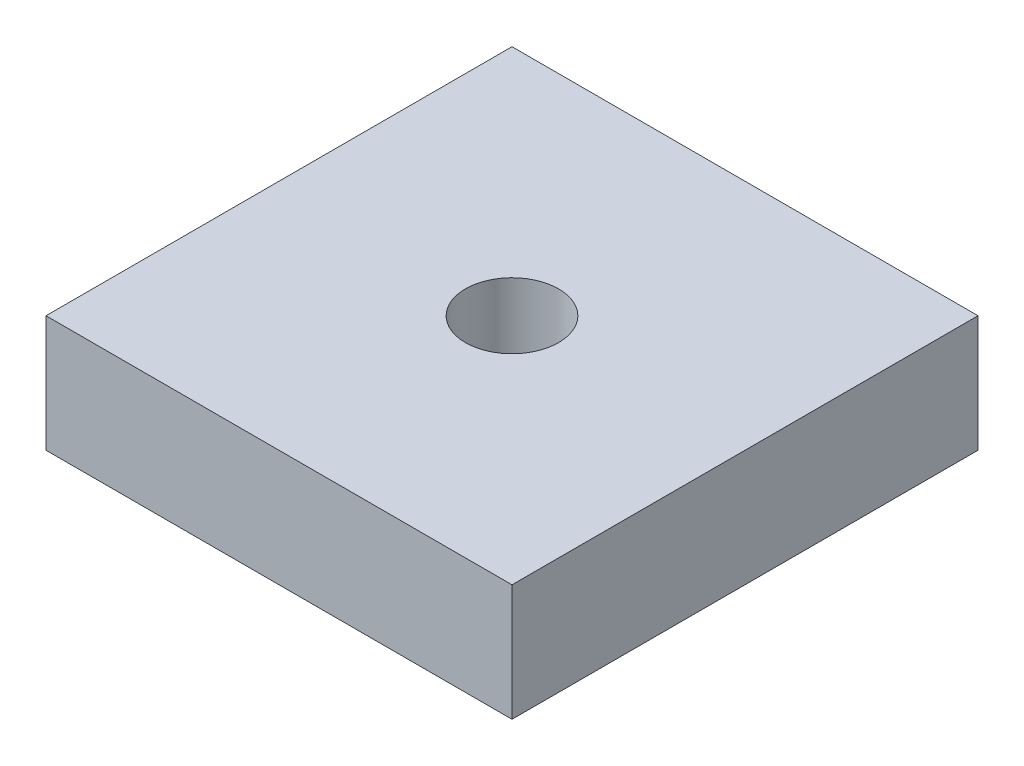
ISO-10303-21;
HEADER;
FILE_DESCRIPTION(('STEP AP214'),'2;1');
FILE_NAME('part.step','',(''),(''),'','','');
FILE_SCHEMA(('AUTOMOTIVE_DESIGN { 1 0 10303 214 1 1 1 1 }'));
ENDSEC;
DATA;
#1=APPLICATION_CONTEXT('core data for automotive mechanical design processes');
#2=APPLICATION_PROTOCOL_DEFINITION('international standard','automotive_design',2000,#1);
#3=PRODUCT_CONTEXT('',#1,'mechanical');
#4=PRODUCT('Part','Part','',(#3));
#5=PRODUCT_RELATED_PRODUCT_CATEGORY('part','',(#4));
#6=PRODUCT_DEFINITION_FORMATION('','',#4);
#7=PRODUCT_DEFINITION_CONTEXT('part definition',#1,'design');
#8=PRODUCT_DEFINITION('design','',#6,#7);
#9=PRODUCT_DEFINITION_SHAPE('','',#8);
#10=(LENGTH_UNIT() NAMED_UNIT(*) SI_UNIT(.MILLI.,.METRE.));
#11=(NAMED_UNIT(*) PLANE_ANGLE_UNIT() SI_UNIT($,.RADIAN.));
#12=(NAMED_UNIT(*) SI_UNIT($,.STERADIAN.) SOLID_ANGLE_UNIT());
#13=UNCERTAINTY_MEASURE_WITH_UNIT(LENGTH_MEASURE(1.E-05),#10,'distance_accuracy_value','');
#14=(GEOMETRIC_REPRESENTATION_CONTEXT(3) GLOBAL_UNCERTAINTY_ASSIGNED_CONTEXT((#13)) GLOBAL_UNIT_ASSIGNED_CONTEXT((#10,
#11,#12)) REPRESENTATION_CONTEXT('',''));
#15=CARTESIAN_POINT('',(0.,0.,0.));
#16=DIRECTION('',(0.,0.,1.));
#17=DIRECTION('',(1.,0.,0.));
#18=AXIS2_PLACEMENT_3D('',#15,#16,#17);
#19=CARTESIAN_POINT('',(0.,2.5,0.));
#20=DIRECTION('',(0.,1.,0.));
#21=DIRECTION('',(0.,0.,1.));
#22=AXIS2_PLACEMENT_3D('',#19,#20,#21);
#23=PLANE('',#22);
#24=DIRECTION('',(0.,0.,1.));
#25=VECTOR('',#24,1.);
#26=CARTESIAN_POINT('',(-5.,2.5,-5.));
#27=LINE('',#26,#25);
#28=CARTESIAN_POINT('',(-5.,2.5,-5.));
#29=VERTEX_POINT('',#28);
#30=CARTESIAN_POINT('',(-5.,2.5,5.));
#31=VERTEX_POINT('',#30);
#32=EDGE_CURVE('E85',#29,#31,#27,.T.);
#33=ORIENTED_EDGE('',*,*,#32,.T.);
#34=DIRECTION('',(1.,0.,0.));
#35=VECTOR('',#34,1.);
#36=CARTESIAN_POINT('',(-5.,2.5,5.));
#37=LINE('',#36,#35);
#38=CARTESIAN_POINT('',(4.99999999999999,2.5,5.));
#39=VERTEX_POINT('',#38);
#40=EDGE_CURVE('E80',#31,#39,#37,.T.);
#41=ORIENTED_EDGE('',*,*,#40,.T.);
#42=DIRECTION('',(0.,0.,-1.));
#43=VECTOR('',#42,1.);
#44=CARTESIAN_POINT('',(5.,2.5,-5.));
#45=LINE('',#44,#43);
#46=CARTESIAN_POINT('',(5.,2.5,-5.));
#47=VERTEX_POINT('',#46);
#48=EDGE_CURVE('E83',#39,#47,#45,.T.);
#49=ORIENTED_EDGE('',*,*,#48,.T.);
#50=DIRECTION('',(-1.,0.,0.));
#51=VECTOR('',#50,1.);
#52=CARTESIAN_POINT('',(-5.,2.5,-5.));
#53=LINE('',#52,#51);
#54=EDGE_CURVE('E50',#47,#29,#53,.T.);
#55=ORIENTED_EDGE('',*,*,#54,.T.);
#56=EDGE_LOOP('',(#33,#41,#49,#55));
#57=FACE_BOUND('',#56,.T.);
#58=CARTESIAN_POINT('',(0.,2.5,0.));
#59=DIRECTION('',(0.,1.,0.));
#60=DIRECTION('',(0.,0.,1.));
#61=AXIS2_PLACEMENT_3D('',#58,#59,#60);
#62=CIRCLE('',#61,1.);
#63=CARTESIAN_POINT('',(0.,2.5,1.));
#64=VERTEX_POINT('',#63);
#65=EDGE_CURVE('E100',#64,#64,#62,.T.);
#66=ORIENTED_EDGE('',*,*,#65,.F.);
#67=EDGE_LOOP('',(#66));
#68=FACE_BOUND('',#67,.T.);
#69=ADVANCED_FACE('F33',(#57,#68),#23,.T.);
#70=CARTESIAN_POINT('',(0.,0.,0.));
#71=DIRECTION('',(0.,1.,0.));
#72=DIRECTION('',(0.,0.,1.));
#73=AXIS2_PLACEMENT_3D('',#70,#71,#72);
#74=PLANE('',#73);
#75=DIRECTION('',(0.,0.,1.));
#76=VECTOR('',#75,1.);
#77=CARTESIAN_POINT('',(-5.,0.,-5.));
#78=LINE('',#77,#76);
#79=CARTESIAN_POINT('',(-5.,0.,-5.));
#80=VERTEX_POINT('',#79);
#81=CARTESIAN_POINT('',(-5.,0.,5.));
#82=VERTEX_POINT('',#81);
#83=EDGE_CURVE('E97',#80,#82,#78,.T.);
#84=ORIENTED_EDGE('',*,*,#83,.F.);
#85=DIRECTION('',(-1.,0.,0.));
#86=VECTOR('',#85,1.);
#87=CARTESIAN_POINT('',(-5.,0.,-5.));
#88=LINE('',#87,#86);
#89=CARTESIAN_POINT('',(5.,0.,-5.));
#90=VERTEX_POINT('',#89);
#91=EDGE_CURVE('E73',#90,#80,#88,.T.);
#92=ORIENTED_EDGE('',*,*,#91,.F.);
#93=DIRECTION('',(0.,0.,-1.));
#94=VECTOR('',#93,1.);
#95=CARTESIAN_POINT('',(5.,0.,-5.));
#96=LINE('',#95,#94);
#97=CARTESIAN_POINT('',(4.99999999999999,0.,5.));
#98=VERTEX_POINT('',#97);
#99=EDGE_CURVE('E67',#98,#90,#96,.T.);
#100=ORIENTED_EDGE('',*,*,#99,.F.);
#101=DIRECTION('',(1.,0.,0.));
#102=VECTOR('',#101,1.);
#103=CARTESIAN_POINT('',(-5.,0.,5.));
#104=LINE('',#103,#102);
#105=EDGE_CURVE('E89',#82,#98,#104,.T.);
#106=ORIENTED_EDGE('',*,*,#105,.F.);
#107=EDGE_LOOP('',(#84,#92,#100,#106));
#108=FACE_BOUND('',#107,.T.);
#109=CARTESIAN_POINT('',(0.,0.,0.));
#110=DIRECTION('',(0.,1.,0.));
#111=DIRECTION('',(0.,0.,1.));
#112=AXIS2_PLACEMENT_3D('',#109,#110,#111);
#113=CIRCLE('',#112,1.);
#114=CARTESIAN_POINT('',(0.,0.,1.));
#115=VERTEX_POINT('',#114);
#116=EDGE_CURVE('E112',#115,#115,#113,.T.);
#117=ORIENTED_EDGE('',*,*,#116,.T.);
#118=EDGE_LOOP('',(#117));
#119=FACE_BOUND('',#118,.T.);
#120=ADVANCED_FACE('F108',(#108,#119),#74,.F.);
#121=CARTESIAN_POINT('',(-5.,2.5,-5.));
#122=DIRECTION('',(1.,0.,0.));
#123=DIRECTION('',(0.,0.,-1.));
#124=AXIS2_PLACEMENT_3D('',#121,#122,#123);
#125=PLANE('',#124);
#126=ORIENTED_EDGE('',*,*,#83,.T.);
#127=DIRECTION('',(0.,-1.,0.));
#128=VECTOR('',#127,1.);
#129=CARTESIAN_POINT('',(-5.,2.5,5.));
#130=LINE('',#129,#128);
#131=EDGE_CURVE('E11',#31,#82,#130,.T.);
#132=ORIENTED_EDGE('',*,*,#131,.F.);
#133=ORIENTED_EDGE('',*,*,#32,.F.);
#134=DIRECTION('',(0.,-1.,0.));
#135=VECTOR('',#134,1.);
#136=CARTESIAN_POINT('',(-5.,2.5,-5.));
#137=LINE('',#136,#135);
#138=EDGE_CURVE('E93',#29,#80,#137,.T.);
#139=ORIENTED_EDGE('',*,*,#138,.T.);
#140=EDGE_LOOP('',(#126,#132,#133,#139));
#141=FACE_BOUND('',#140,.T.);
#142=ADVANCED_FACE('F35',(#141),#125,.F.);
#143=CARTESIAN_POINT('',(-5.,2.5,5.));
#144=DIRECTION('',(0.,0.,-1.));
#145=DIRECTION('',(-1.,0.,0.));
#146=AXIS2_PLACEMENT_3D('',#143,#144,#145);
#147=PLANE('',#146);
#148=ORIENTED_EDGE('',*,*,#105,.T.);
#149=DIRECTION('',(0.,-1.,0.));
#150=VECTOR('',#149,1.);
#151=CARTESIAN_POINT('',(4.99999999999999,2.5,5.));
#152=LINE('',#151,#150);
#153=EDGE_CURVE('E42',#39,#98,#152,.T.);
#154=ORIENTED_EDGE('',*,*,#153,.F.);
#155=ORIENTED_EDGE('',*,*,#40,.F.);
#156=ORIENTED_EDGE('',*,*,#131,.T.);
#157=EDGE_LOOP('',(#148,#154,#155,#156));
#158=FACE_BOUND('',#157,.T.);
#159=ADVANCED_FACE('F88',(#158),#147,.F.);
#160=CARTESIAN_POINT('',(5.,2.5,-5.));
#161=DIRECTION('',(-1.,0.,0.));
#162=DIRECTION('',(0.,0.,1.));
#163=AXIS2_PLACEMENT_3D('',#160,#161,#162);
#164=PLANE('',#163);
#165=ORIENTED_EDGE('',*,*,#99,.T.);
#166=DIRECTION('',(0.,-1.,0.));
#167=VECTOR('',#166,1.);
#168=CARTESIAN_POINT('',(5.,2.5,-5.));
#169=LINE('',#168,#167);
#170=EDGE_CURVE('E90',#47,#90,#169,.T.);
#171=ORIENTED_EDGE('',*,*,#170,.F.);
#172=ORIENTED_EDGE('',*,*,#48,.F.);
#173=ORIENTED_EDGE('',*,*,#153,.T.);
#174=EDGE_LOOP('',(#165,#171,#172,#173));
#175=FACE_BOUND('',#174,.T.);
#176=ADVANCED_FACE('F91',(#175),#164,.F.);
#177=CARTESIAN_POINT('',(-5.,2.5,-5.));
#178=DIRECTION('',(0.,0.,1.));
#179=DIRECTION('',(1.,0.,0.));
#180=AXIS2_PLACEMENT_3D('',#177,#178,#179);
#181=PLANE('',#180);
#182=ORIENTED_EDGE('',*,*,#91,.T.);
#183=ORIENTED_EDGE('',*,*,#138,.F.);
#184=ORIENTED_EDGE('',*,*,#54,.F.);
#185=ORIENTED_EDGE('',*,*,#170,.T.);
#186=EDGE_LOOP('',(#182,#183,#184,#185));
#187=FACE_BOUND('',#186,.T.);
#188=ADVANCED_FACE('F105',(#187),#181,.F.);
#189=CARTESIAN_POINT('',(0.,2.5,0.));
#190=DIRECTION('',(0.,-1.,0.));
#191=DIRECTION('',(0.,0.,-1.));
#192=AXIS2_PLACEMENT_3D('',#189,#190,#191);
#193=CYLINDRICAL_SURFACE('',#192,1.);
#194=ORIENTED_EDGE('',*,*,#65,.T.);
#195=EDGE_LOOP('',(#194));
#196=FACE_BOUND('',#195,.T.);
#197=ORIENTED_EDGE('',*,*,#116,.F.);
#198=EDGE_LOOP('',(#197));
#199=FACE_BOUND('',#198,.T.);
#200=ADVANCED_FACE('F118',(#196,#199),#193,.F.);
#201=CLOSED_SHELL('',(#69,#120,#142,#159,#176,#188,#200));
#202=MANIFOLD_SOLID_BREP('B2',#201);
#203=ADVANCED_BREP_SHAPE_REPRESENTATION('',(#18,#202),#14);
#204=SHAPE_DEFINITION_REPRESENTATION(#9,#203);
ENDSEC;
END-ISO-10303-21;
